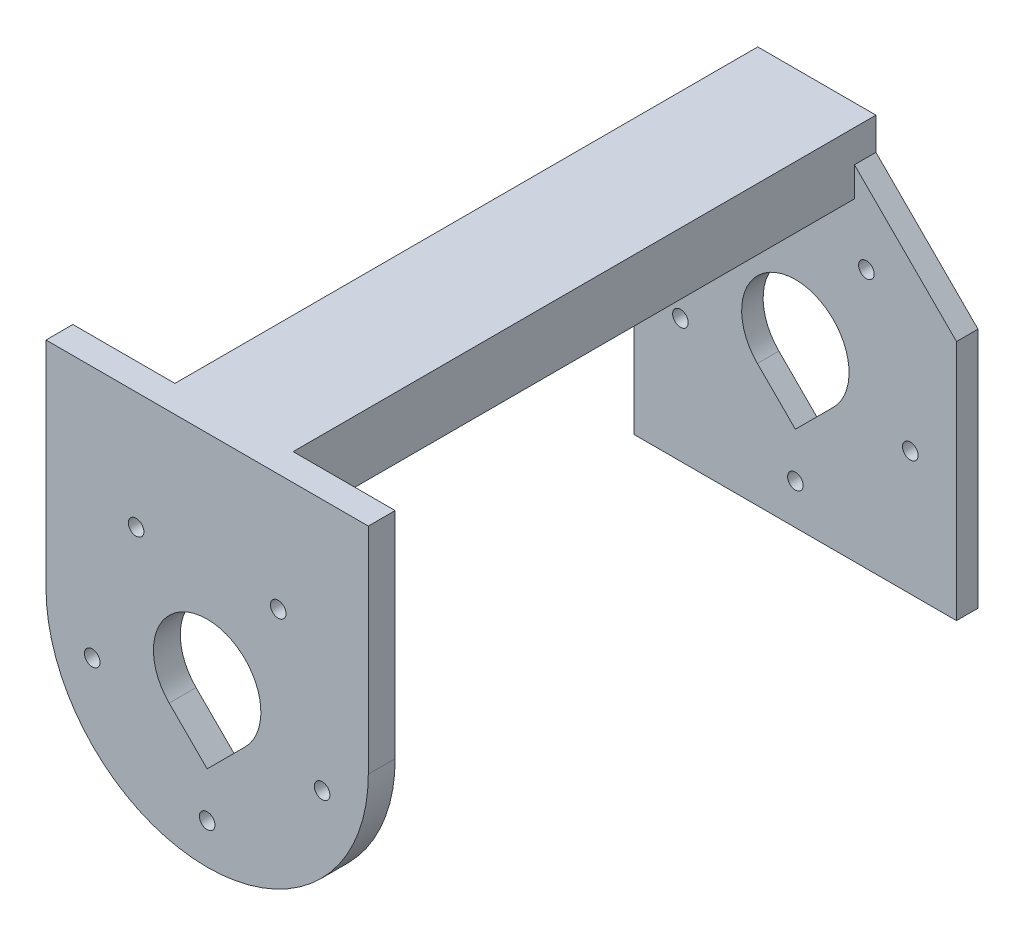
ISO-10303-21;
HEADER;
FILE_DESCRIPTION(('STEP AP214'),'2;1');
FILE_NAME('part.step','',(''),(''),'','','');
FILE_SCHEMA(('AUTOMOTIVE_DESIGN { 1 0 10303 214 1 1 1 1 }'));
ENDSEC;
DATA;
#1=APPLICATION_CONTEXT('core data for automotive mechanical design processes');
#2=APPLICATION_PROTOCOL_DEFINITION('international standard','automotive_design',2000,#1);
#3=PRODUCT_CONTEXT('',#1,'mechanical');
#4=PRODUCT('Part','Part','',(#3));
#5=PRODUCT_RELATED_PRODUCT_CATEGORY('part','',(#4));
#6=PRODUCT_DEFINITION_FORMATION('','',#4);
#7=PRODUCT_DEFINITION_CONTEXT('part definition',#1,'design');
#8=PRODUCT_DEFINITION('design','',#6,#7);
#9=PRODUCT_DEFINITION_SHAPE('','',#8);
#10=(LENGTH_UNIT() NAMED_UNIT(*) SI_UNIT(.MILLI.,.METRE.));
#11=(NAMED_UNIT(*) PLANE_ANGLE_UNIT() SI_UNIT($,.RADIAN.));
#12=(NAMED_UNIT(*) SI_UNIT($,.STERADIAN.) SOLID_ANGLE_UNIT());
#13=UNCERTAINTY_MEASURE_WITH_UNIT(LENGTH_MEASURE(1.E-05),#10,'distance_accuracy_value','');
#14=(GEOMETRIC_REPRESENTATION_CONTEXT(3) GLOBAL_UNCERTAINTY_ASSIGNED_CONTEXT((#13)) GLOBAL_UNIT_ASSIGNED_CONTEXT((#10,
#11,#12)) REPRESENTATION_CONTEXT('',''));
#15=CARTESIAN_POINT('',(0.,0.,0.));
#16=DIRECTION('',(0.,0.,1.));
#17=DIRECTION('',(1.,0.,0.));
#18=AXIS2_PLACEMENT_3D('',#15,#16,#17);
#19=CARTESIAN_POINT('',(289.,328.5,384.5));
#20=DIRECTION('',(0.,1.,0.));
#21=DIRECTION('',(0.,0.,1.));
#22=AXIS2_PLACEMENT_3D('',#19,#20,#21);
#23=PLANE('',#22);
#24=DIRECTION('',(-1.,0.,0.));
#25=VECTOR('',#24,1.);
#26=CARTESIAN_POINT('',(289.,328.5,280.));
#27=LINE('',#26,#25);
#28=CARTESIAN_POINT('',(311.,328.5,280.));
#29=VERTEX_POINT('',#28);
#30=CARTESIAN_POINT('',(289.,328.5,280.));
#31=VERTEX_POINT('',#30);
#32=EDGE_CURVE('E248',#29,#31,#27,.T.);
#33=ORIENTED_EDGE('',*,*,#32,.F.);
#34=DIRECTION('',(0.,0.,-1.));
#35=VECTOR('',#34,1.);
#36=CARTESIAN_POINT('',(311.,328.5,384.5));
#37=LINE('',#36,#35);
#38=CARTESIAN_POINT('',(311.,328.5,384.5));
#39=VERTEX_POINT('',#38);
#40=EDGE_CURVE('E273',#39,#29,#37,.T.);
#41=ORIENTED_EDGE('',*,*,#40,.F.);
#42=DIRECTION('',(1.,0.,0.));
#43=VECTOR('',#42,1.);
#44=CARTESIAN_POINT('',(289.,328.5,384.5));
#45=LINE('',#44,#43);
#46=CARTESIAN_POINT('',(289.,328.5,384.5));
#47=VERTEX_POINT('',#46);
#48=EDGE_CURVE('E256',#47,#39,#45,.T.);
#49=ORIENTED_EDGE('',*,*,#48,.F.);
#50=DIRECTION('',(0.,0.,-1.));
#51=VECTOR('',#50,1.);
#52=CARTESIAN_POINT('',(289.,328.5,384.5));
#53=LINE('',#52,#51);
#54=EDGE_CURVE('E276',#47,#31,#53,.T.);
#55=ORIENTED_EDGE('',*,*,#54,.T.);
#56=EDGE_LOOP('',(#33,#41,#49,#55));
#57=FACE_BOUND('',#56,.T.);
#58=ADVANCED_FACE('F39',(#57),#23,.F.);
#59=CARTESIAN_POINT('',(311.,328.5,384.5));
#60=DIRECTION('',(-1.,0.,0.));
#61=DIRECTION('',(0.,0.,1.));
#62=AXIS2_PLACEMENT_3D('',#59,#60,#61);
#63=PLANE('',#62);
#64=DIRECTION('',(0.,1.,0.));
#65=VECTOR('',#64,1.);
#66=CARTESIAN_POINT('',(311.,328.5,276.));
#67=LINE('',#66,#65);
#68=CARTESIAN_POINT('',(311.,334.,276.));
#69=VERTEX_POINT('',#68);
#70=CARTESIAN_POINT('',(311.,340.,276.));
#71=VERTEX_POINT('',#70);
#72=EDGE_CURVE('E265',#69,#71,#67,.T.);
#73=ORIENTED_EDGE('',*,*,#72,.T.);
#74=DIRECTION('',(0.,0.,-1.));
#75=VECTOR('',#74,1.);
#76=CARTESIAN_POINT('',(311.,340.,384.5));
#77=LINE('',#76,#75);
#78=CARTESIAN_POINT('',(311.,340.,384.5));
#79=VERTEX_POINT('',#78);
#80=EDGE_CURVE('E271',#79,#71,#77,.T.);
#81=ORIENTED_EDGE('',*,*,#80,.F.);
#82=DIRECTION('',(0.,1.,0.));
#83=VECTOR('',#82,1.);
#84=CARTESIAN_POINT('',(311.,328.5,384.5));
#85=LINE('',#84,#83);
#86=EDGE_CURVE('E260',#39,#79,#85,.T.);
#87=ORIENTED_EDGE('',*,*,#86,.F.);
#88=ORIENTED_EDGE('',*,*,#40,.T.);
#89=DIRECTION('',(0.,-1.,0.));
#90=VECTOR('',#89,1.);
#91=CARTESIAN_POINT('',(311.,328.5,280.));
#92=LINE('',#91,#90);
#93=CARTESIAN_POINT('',(311.,334.,280.));
#94=VERTEX_POINT('',#93);
#95=EDGE_CURVE('E11',#94,#29,#92,.T.);
#96=ORIENTED_EDGE('',*,*,#95,.F.);
#97=DIRECTION('',(0.,0.,-1.));
#98=VECTOR('',#97,1.);
#99=CARTESIAN_POINT('',(311.,334.,280.));
#100=LINE('',#99,#98);
#101=EDGE_CURVE('E224',#94,#69,#100,.T.);
#102=ORIENTED_EDGE('',*,*,#101,.T.);
#103=EDGE_LOOP('',(#73,#81,#87,#88,#96,#102));
#104=FACE_BOUND('',#103,.T.);
#105=ADVANCED_FACE('F396',(#104),#63,.F.);
#106=CARTESIAN_POINT('',(300.,300.,389.5));
#107=DIRECTION('',(0.,0.,1.));
#108=DIRECTION('',(1.,0.,0.));
#109=AXIS2_PLACEMENT_3D('',#106,#107,#108);
#110=PLANE('',#109);
#111=CARTESIAN_POINT('',(278.601228383359,293.047117626564,389.5));
#112=DIRECTION('',(0.,0.,1.));
#113=DIRECTION('',(1.,0.,0.));
#114=AXIS2_PLACEMENT_3D('',#111,#112,#113);
#115=CIRCLE('',#114,1.45000000000001);
#116=CARTESIAN_POINT('',(280.051228383359,293.047117626564,389.5));
#117=VERTEX_POINT('',#116);
#118=EDGE_CURVE('E295',#117,#117,#115,.T.);
#119=ORIENTED_EDGE('',*,*,#118,.F.);
#120=EDGE_LOOP('',(#119));
#121=FACE_BOUND('',#120,.T.);
#122=CARTESIAN_POINT('',(321.398771616641,293.047117626564,389.5));
#123=DIRECTION('',(0.,0.,1.));
#124=DIRECTION('',(1.,0.,0.));
#125=AXIS2_PLACEMENT_3D('',#122,#123,#124);
#126=CIRCLE('',#125,1.45000000000001);
#127=CARTESIAN_POINT('',(322.848771616641,293.047117626564,389.5));
#128=VERTEX_POINT('',#127);
#129=EDGE_CURVE('E282',#128,#128,#126,.T.);
#130=ORIENTED_EDGE('',*,*,#129,.F.);
#131=EDGE_LOOP('',(#130));
#132=FACE_BOUND('',#131,.T.);
#133=DIRECTION('',(0.707106781186545,-0.70710678118655,0.));
#134=VECTOR('',#133,1.);
#135=CARTESIAN_POINT('',(292.928932188135,292.928932188135,389.5));
#136=LINE('',#135,#134);
#137=CARTESIAN_POINT('',(292.928932188135,292.928932188135,389.5));
#138=VERTEX_POINT('',#137);
#139=CARTESIAN_POINT('',(300.,285.857864376269,389.5));
#140=VERTEX_POINT('',#139);
#141=EDGE_CURVE('E311',#138,#140,#136,.T.);
#142=ORIENTED_EDGE('',*,*,#141,.F.);
#143=CARTESIAN_POINT('',(300.,300.,389.5));
#144=DIRECTION('',(0.,0.,1.));
#145=DIRECTION('',(1.,0.,0.));
#146=AXIS2_PLACEMENT_3D('',#143,#144,#145);
#147=CIRCLE('',#146,9.99999999999998);
#148=CARTESIAN_POINT('',(307.071067811865,292.928932188135,389.5));
#149=VERTEX_POINT('',#148);
#150=EDGE_CURVE('E309',#149,#138,#147,.T.);
#151=ORIENTED_EDGE('',*,*,#150,.F.);
#152=DIRECTION('',(0.707106781186547,0.707106781186547,0.));
#153=VECTOR('',#152,1.);
#154=CARTESIAN_POINT('',(300.,285.857864376269,389.5));
#155=LINE('',#154,#153);
#156=EDGE_CURVE('E315',#140,#149,#155,.T.);
#157=ORIENTED_EDGE('',*,*,#156,.F.);
#158=EDGE_LOOP('',(#142,#151,#157));
#159=FACE_BOUND('',#158,.T.);
#160=CARTESIAN_POINT('',(300.,300.,389.5));
#161=DIRECTION('',(0.,0.,1.));
#162=DIRECTION('',(1.,0.,0.));
#163=AXIS2_PLACEMENT_3D('',#160,#161,#162);
#164=CIRCLE('',#163,30.);
#165=CARTESIAN_POINT('',(270.,300.,389.5));
#166=VERTEX_POINT('',#165);
#167=CARTESIAN_POINT('',(330.,300.,389.5));
#168=VERTEX_POINT('',#167);
#169=EDGE_CURVE('E47',#166,#168,#164,.T.);
#170=ORIENTED_EDGE('',*,*,#169,.T.);
#171=DIRECTION('',(0.,1.,0.));
#172=VECTOR('',#171,1.);
#173=CARTESIAN_POINT('',(330.,300.,389.5));
#174=LINE('',#173,#172);
#175=CARTESIAN_POINT('',(330.,340.,389.5));
#176=VERTEX_POINT('',#175);
#177=EDGE_CURVE('E336',#168,#176,#174,.T.);
#178=ORIENTED_EDGE('',*,*,#177,.T.);
#179=DIRECTION('',(-1.,0.,0.));
#180=VECTOR('',#179,1.);
#181=CARTESIAN_POINT('',(330.,340.,389.5));
#182=LINE('',#181,#180);
#183=CARTESIAN_POINT('',(270.,340.,389.5));
#184=VERTEX_POINT('',#183);
#185=EDGE_CURVE('E339',#176,#184,#182,.T.);
#186=ORIENTED_EDGE('',*,*,#185,.T.);
#187=DIRECTION('',(0.,-1.,0.));
#188=VECTOR('',#187,1.);
#189=CARTESIAN_POINT('',(270.,340.,389.5));
#190=LINE('',#189,#188);
#191=EDGE_CURVE('E333',#184,#166,#190,.T.);
#192=ORIENTED_EDGE('',*,*,#191,.T.);
#193=EDGE_LOOP('',(#170,#178,#186,#192));
#194=FACE_BOUND('',#193,.T.);
#195=CARTESIAN_POINT('',(313.225168176581,318.202882373436,389.5));
#196=DIRECTION('',(0.,0.,1.));
#197=DIRECTION('',(1.,0.,0.));
#198=AXIS2_PLACEMENT_3D('',#195,#196,#197);
#199=CIRCLE('',#198,1.45000000000001);
#200=CARTESIAN_POINT('',(314.675168176581,318.202882373436,389.5));
#201=VERTEX_POINT('',#200);
#202=EDGE_CURVE('E278',#201,#201,#199,.T.);
#203=ORIENTED_EDGE('',*,*,#202,.F.);
#204=EDGE_LOOP('',(#203));
#205=FACE_BOUND('',#204,.T.);
#206=CARTESIAN_POINT('',(300.,277.5,389.5));
#207=DIRECTION('',(0.,0.,1.));
#208=DIRECTION('',(1.,0.,0.));
#209=AXIS2_PLACEMENT_3D('',#206,#207,#208);
#210=CIRCLE('',#209,1.45000000000001);
#211=CARTESIAN_POINT('',(301.45,277.5,389.5));
#212=VERTEX_POINT('',#211);
#213=EDGE_CURVE('E301',#212,#212,#210,.T.);
#214=ORIENTED_EDGE('',*,*,#213,.F.);
#215=EDGE_LOOP('',(#214));
#216=FACE_BOUND('',#215,.T.);
#217=CARTESIAN_POINT('',(286.774831823419,318.202882373436,389.5));
#218=DIRECTION('',(0.,0.,1.));
#219=DIRECTION('',(1.,0.,0.));
#220=AXIS2_PLACEMENT_3D('',#217,#218,#219);
#221=CIRCLE('',#220,1.45000000000001);
#222=CARTESIAN_POINT('',(288.224831823419,318.202882373436,389.5));
#223=VERTEX_POINT('',#222);
#224=EDGE_CURVE('E289',#223,#223,#221,.T.);
#225=ORIENTED_EDGE('',*,*,#224,.F.);
#226=EDGE_LOOP('',(#225));
#227=FACE_BOUND('',#226,.T.);
#228=ADVANCED_FACE('F382',(#121,#132,#159,#194,#205,#216,#227),#110,.T.);
#229=CARTESIAN_POINT('',(300.,300.,384.5));
#230=DIRECTION('',(0.,0.,1.));
#231=DIRECTION('',(1.,0.,0.));
#232=AXIS2_PLACEMENT_3D('',#229,#230,#231);
#233=PLANE('',#232);
#234=DIRECTION('',(-1.,0.,0.));
#235=VECTOR('',#234,1.);
#236=CARTESIAN_POINT('',(330.,340.,384.5));
#237=LINE('',#236,#235);
#238=CARTESIAN_POINT('',(289.,340.,384.5));
#239=VERTEX_POINT('',#238);
#240=CARTESIAN_POINT('',(270.,340.,384.5));
#241=VERTEX_POINT('',#240);
#242=EDGE_CURVE('E346',#239,#241,#237,.T.);
#243=ORIENTED_EDGE('',*,*,#242,.F.);
#244=DIRECTION('',(0.,-1.,0.));
#245=VECTOR('',#244,1.);
#246=CARTESIAN_POINT('',(289.,340.,384.5));
#247=LINE('',#246,#245);
#248=EDGE_CURVE('E253',#239,#47,#247,.T.);
#249=ORIENTED_EDGE('',*,*,#248,.T.);
#250=ORIENTED_EDGE('',*,*,#48,.T.);
#251=ORIENTED_EDGE('',*,*,#86,.T.);
#252=CARTESIAN_POINT('',(330.,340.,384.5));
#253=VERTEX_POINT('',#252);
#254=EDGE_CURVE('E337',#253,#79,#237,.T.);
#255=ORIENTED_EDGE('',*,*,#254,.F.);
#256=DIRECTION('',(0.,1.,0.));
#257=VECTOR('',#256,1.);
#258=CARTESIAN_POINT('',(330.,300.,384.5));
#259=LINE('',#258,#257);
#260=CARTESIAN_POINT('',(330.,300.,384.5));
#261=VERTEX_POINT('',#260);
#262=EDGE_CURVE('E344',#261,#253,#259,.T.);
#263=ORIENTED_EDGE('',*,*,#262,.F.);
#264=CARTESIAN_POINT('',(300.,300.,384.5));
#265=DIRECTION('',(0.,0.,1.));
#266=DIRECTION('',(1.,0.,0.));
#267=AXIS2_PLACEMENT_3D('',#264,#265,#266);
#268=CIRCLE('',#267,30.);
#269=CARTESIAN_POINT('',(270.,300.,384.5));
#270=VERTEX_POINT('',#269);
#271=EDGE_CURVE('E360',#270,#261,#268,.T.);
#272=ORIENTED_EDGE('',*,*,#271,.F.);
#273=DIRECTION('',(0.,-1.,0.));
#274=VECTOR('',#273,1.);
#275=CARTESIAN_POINT('',(270.,340.,384.5));
#276=LINE('',#275,#274);
#277=EDGE_CURVE('E332',#241,#270,#276,.T.);
#278=ORIENTED_EDGE('',*,*,#277,.F.);
#279=EDGE_LOOP('',(#243,#249,#250,#251,#255,#263,#272,#278));
#280=FACE_BOUND('',#279,.T.);
#281=CARTESIAN_POINT('',(300.,300.,384.5));
#282=DIRECTION('',(0.,0.,1.));
#283=DIRECTION('',(1.,0.,0.));
#284=AXIS2_PLACEMENT_3D('',#281,#282,#283);
#285=CIRCLE('',#284,9.99999999999998);
#286=CARTESIAN_POINT('',(307.071067811865,292.928932188135,384.5));
#287=VERTEX_POINT('',#286);
#288=CARTESIAN_POINT('',(292.928932188135,292.928932188135,384.5));
#289=VERTEX_POINT('',#288);
#290=EDGE_CURVE('E288',#287,#289,#285,.T.);
#291=ORIENTED_EDGE('',*,*,#290,.T.);
#292=DIRECTION('',(0.707106781186545,-0.70710678118655,0.));
#293=VECTOR('',#292,1.);
#294=CARTESIAN_POINT('',(292.928932188135,292.928932188135,384.5));
#295=LINE('',#294,#293);
#296=CARTESIAN_POINT('',(300.,285.857864376269,384.5));
#297=VERTEX_POINT('',#296);
#298=EDGE_CURVE('E320',#289,#297,#295,.T.);
#299=ORIENTED_EDGE('',*,*,#298,.T.);
#300=DIRECTION('',(0.707106781186547,0.707106781186547,0.));
#301=VECTOR('',#300,1.);
#302=CARTESIAN_POINT('',(300.,285.857864376269,384.5));
#303=LINE('',#302,#301);
#304=EDGE_CURVE('E312',#297,#287,#303,.T.);
#305=ORIENTED_EDGE('',*,*,#304,.T.);
#306=EDGE_LOOP('',(#291,#299,#305));
#307=FACE_BOUND('',#306,.T.);
#308=CARTESIAN_POINT('',(313.225168176581,318.202882373436,384.5));
#309=DIRECTION('',(0.,0.,1.));
#310=DIRECTION('',(1.,0.,0.));
#311=AXIS2_PLACEMENT_3D('',#308,#309,#310);
#312=CIRCLE('',#311,1.45000000000001);
#313=CARTESIAN_POINT('',(314.675168176581,318.202882373436,384.5));
#314=VERTEX_POINT('',#313);
#315=EDGE_CURVE('E279',#314,#314,#312,.T.);
#316=ORIENTED_EDGE('',*,*,#315,.T.);
#317=EDGE_LOOP('',(#316));
#318=FACE_BOUND('',#317,.T.);
#319=CARTESIAN_POINT('',(321.398771616641,293.047117626564,384.5));
#320=DIRECTION('',(0.,0.,1.));
#321=DIRECTION('',(1.,0.,0.));
#322=AXIS2_PLACEMENT_3D('',#319,#320,#321);
#323=CIRCLE('',#322,1.45000000000001);
#324=CARTESIAN_POINT('',(322.848771616641,293.047117626564,384.5));
#325=VERTEX_POINT('',#324);
#326=EDGE_CURVE('E304',#325,#325,#323,.T.);
#327=ORIENTED_EDGE('',*,*,#326,.T.);
#328=EDGE_LOOP('',(#327));
#329=FACE_BOUND('',#328,.T.);
#330=CARTESIAN_POINT('',(300.,277.5,384.5));
#331=DIRECTION('',(0.,0.,1.));
#332=DIRECTION('',(1.,0.,0.));
#333=AXIS2_PLACEMENT_3D('',#330,#331,#332);
#334=CIRCLE('',#333,1.45000000000001);
#335=CARTESIAN_POINT('',(301.45,277.5,384.5));
#336=VERTEX_POINT('',#335);
#337=EDGE_CURVE('E298',#336,#336,#334,.T.);
#338=ORIENTED_EDGE('',*,*,#337,.T.);
#339=EDGE_LOOP('',(#338));
#340=FACE_BOUND('',#339,.T.);
#341=CARTESIAN_POINT('',(278.601228383359,293.047117626564,384.5));
#342=DIRECTION('',(0.,0.,1.));
#343=DIRECTION('',(1.,0.,0.));
#344=AXIS2_PLACEMENT_3D('',#341,#342,#343);
#345=CIRCLE('',#344,1.45000000000001);
#346=CARTESIAN_POINT('',(280.051228383359,293.047117626564,384.5));
#347=VERTEX_POINT('',#346);
#348=EDGE_CURVE('E292',#347,#347,#345,.T.);
#349=ORIENTED_EDGE('',*,*,#348,.T.);
#350=EDGE_LOOP('',(#349));
#351=FACE_BOUND('',#350,.T.);
#352=CARTESIAN_POINT('',(286.774831823419,318.202882373436,384.5));
#353=DIRECTION('',(0.,0.,1.));
#354=DIRECTION('',(1.,0.,0.));
#355=AXIS2_PLACEMENT_3D('',#352,#353,#354);
#356=CIRCLE('',#355,1.45000000000001);
#357=CARTESIAN_POINT('',(288.224831823419,318.202882373436,384.5));
#358=VERTEX_POINT('',#357);
#359=EDGE_CURVE('E285',#358,#358,#356,.T.);
#360=ORIENTED_EDGE('',*,*,#359,.T.);
#361=EDGE_LOOP('',(#360));
#362=FACE_BOUND('',#361,.T.);
#363=ADVANCED_FACE('F373',(#280,#307,#318,#329,#340,#351,#362),#233,.F.);
#364=CARTESIAN_POINT('',(300.,300.,389.5));
#365=DIRECTION('',(0.,0.,-1.));
#366=DIRECTION('',(-1.,0.,0.));
#367=AXIS2_PLACEMENT_3D('',#364,#365,#366);
#368=CYLINDRICAL_SURFACE('',#367,30.);
#369=DIRECTION('',(0.,0.,-1.));
#370=VECTOR('',#369,1.);
#371=CARTESIAN_POINT('',(270.,300.,389.5));
#372=LINE('',#371,#370);
#373=EDGE_CURVE('E357',#166,#270,#372,.T.);
#374=ORIENTED_EDGE('',*,*,#373,.T.);
#375=ORIENTED_EDGE('',*,*,#271,.T.);
#376=DIRECTION('',(0.,0.,-1.));
#377=VECTOR('',#376,1.);
#378=CARTESIAN_POINT('',(330.,300.,389.5));
#379=LINE('',#378,#377);
#380=EDGE_CURVE('E354',#168,#261,#379,.T.);
#381=ORIENTED_EDGE('',*,*,#380,.F.);
#382=ORIENTED_EDGE('',*,*,#169,.F.);
#383=EDGE_LOOP('',(#374,#375,#381,#382));
#384=FACE_BOUND('',#383,.T.);
#385=ADVANCED_FACE('F41',(#384),#368,.T.);
#386=CARTESIAN_POINT('',(270.,340.,389.5));
#387=DIRECTION('',(1.,0.,0.));
#388=DIRECTION('',(0.,0.,-1.));
#389=AXIS2_PLACEMENT_3D('',#386,#387,#388);
#390=PLANE('',#389);
#391=ORIENTED_EDGE('',*,*,#277,.T.);
#392=ORIENTED_EDGE('',*,*,#373,.F.);
#393=ORIENTED_EDGE('',*,*,#191,.F.);
#394=DIRECTION('',(0.,0.,-1.));
#395=VECTOR('',#394,1.);
#396=CARTESIAN_POINT('',(270.,340.,389.5));
#397=LINE('',#396,#395);
#398=EDGE_CURVE('E341',#184,#241,#397,.T.);
#399=ORIENTED_EDGE('',*,*,#398,.T.);
#400=EDGE_LOOP('',(#391,#392,#393,#399));
#401=FACE_BOUND('',#400,.T.);
#402=ADVANCED_FACE('F385',(#401),#390,.F.);
#403=CARTESIAN_POINT('',(330.,300.,389.5));
#404=DIRECTION('',(-1.,0.,0.));
#405=DIRECTION('',(0.,0.,1.));
#406=AXIS2_PLACEMENT_3D('',#403,#404,#405);
#407=PLANE('',#406);
#408=ORIENTED_EDGE('',*,*,#262,.T.);
#409=DIRECTION('',(0.,0.,-1.));
#410=VECTOR('',#409,1.);
#411=CARTESIAN_POINT('',(330.,340.,389.5));
#412=LINE('',#411,#410);
#413=EDGE_CURVE('E351',#176,#253,#412,.T.);
#414=ORIENTED_EDGE('',*,*,#413,.F.);
#415=ORIENTED_EDGE('',*,*,#177,.F.);
#416=ORIENTED_EDGE('',*,*,#380,.T.);
#417=EDGE_LOOP('',(#408,#414,#415,#416));
#418=FACE_BOUND('',#417,.T.);
#419=ADVANCED_FACE('F369',(#418),#407,.F.);
#420=CARTESIAN_POINT('',(330.,340.,389.5));
#421=DIRECTION('',(0.,-1.,0.));
#422=DIRECTION('',(0.,0.,-1.));
#423=AXIS2_PLACEMENT_3D('',#420,#421,#422);
#424=PLANE('',#423);
#425=DIRECTION('',(-1.,0.,0.));
#426=VECTOR('',#425,1.);
#427=CARTESIAN_POINT('',(311.,340.,276.));
#428=LINE('',#427,#426);
#429=CARTESIAN_POINT('',(289.,340.,276.));
#430=VERTEX_POINT('',#429);
#431=EDGE_CURVE('E257',#71,#430,#428,.T.);
#432=ORIENTED_EDGE('',*,*,#431,.T.);
#433=DIRECTION('',(0.,0.,-1.));
#434=VECTOR('',#433,1.);
#435=CARTESIAN_POINT('',(289.,340.,384.5));
#436=LINE('',#435,#434);
#437=EDGE_CURVE('E263',#239,#430,#436,.T.);
#438=ORIENTED_EDGE('',*,*,#437,.F.);
#439=ORIENTED_EDGE('',*,*,#242,.T.);
#440=ORIENTED_EDGE('',*,*,#398,.F.);
#441=ORIENTED_EDGE('',*,*,#185,.F.);
#442=ORIENTED_EDGE('',*,*,#413,.T.);
#443=ORIENTED_EDGE('',*,*,#254,.T.);
#444=ORIENTED_EDGE('',*,*,#80,.T.);
#445=EDGE_LOOP('',(#432,#438,#439,#440,#441,#442,#443,#444));
#446=FACE_BOUND('',#445,.T.);
#447=ADVANCED_FACE('F377',(#446),#424,.F.);
#448=CARTESIAN_POINT('',(300.,300.,389.5));
#449=DIRECTION('',(0.,0.,-1.));
#450=DIRECTION('',(-1.,0.,0.));
#451=AXIS2_PLACEMENT_3D('',#448,#449,#450);
#452=CYLINDRICAL_SURFACE('',#451,9.99999999999998);
#453=ORIENTED_EDGE('',*,*,#290,.F.);
#454=DIRECTION('',(0.,0.,-1.));
#455=VECTOR('',#454,1.);
#456=CARTESIAN_POINT('',(307.071067811865,292.928932188135,389.5));
#457=LINE('',#456,#455);
#458=EDGE_CURVE('E317',#149,#287,#457,.T.);
#459=ORIENTED_EDGE('',*,*,#458,.F.);
#460=ORIENTED_EDGE('',*,*,#150,.T.);
#461=DIRECTION('',(0.,0.,-1.));
#462=VECTOR('',#461,1.);
#463=CARTESIAN_POINT('',(292.928932188135,292.928932188135,389.5));
#464=LINE('',#463,#462);
#465=EDGE_CURVE('E329',#138,#289,#464,.T.);
#466=ORIENTED_EDGE('',*,*,#465,.T.);
#467=EDGE_LOOP('',(#453,#459,#460,#466));
#468=FACE_BOUND('',#467,.T.);
#469=ADVANCED_FACE('F469',(#468),#452,.F.);
#470=CARTESIAN_POINT('',(292.928932188135,292.928932188135,389.5));
#471=DIRECTION('',(0.70710678118655,0.707106781186545,0.));
#472=DIRECTION('',(-0.707106781186545,0.70710678118655,0.));
#473=AXIS2_PLACEMENT_3D('',#470,#471,#472);
#474=PLANE('',#473);
#475=ORIENTED_EDGE('',*,*,#298,.F.);
#476=ORIENTED_EDGE('',*,*,#465,.F.);
#477=ORIENTED_EDGE('',*,*,#141,.T.);
#478=DIRECTION('',(0.,0.,-1.));
#479=VECTOR('',#478,1.);
#480=CARTESIAN_POINT('',(300.,285.857864376269,389.5));
#481=LINE('',#480,#479);
#482=EDGE_CURVE('E327',#140,#297,#481,.T.);
#483=ORIENTED_EDGE('',*,*,#482,.T.);
#484=EDGE_LOOP('',(#475,#476,#477,#483));
#485=FACE_BOUND('',#484,.T.);
#486=ADVANCED_FACE('F465',(#485),#474,.T.);
#487=CARTESIAN_POINT('',(300.,285.857864376269,389.5));
#488=DIRECTION('',(-0.707106781186548,0.707106781186548,0.));
#489=DIRECTION('',(-0.707106781186548,-0.707106781186548,0.));
#490=AXIS2_PLACEMENT_3D('',#487,#488,#489);
#491=PLANE('',#490);
#492=ORIENTED_EDGE('',*,*,#304,.F.);
#493=ORIENTED_EDGE('',*,*,#482,.F.);
#494=ORIENTED_EDGE('',*,*,#156,.T.);
#495=ORIENTED_EDGE('',*,*,#458,.T.);
#496=EDGE_LOOP('',(#492,#493,#494,#495));
#497=FACE_BOUND('',#496,.T.);
#498=ADVANCED_FACE('F448',(#497),#491,.T.);
#499=CARTESIAN_POINT('',(313.225168176581,318.202882373436,389.5));
#500=DIRECTION('',(0.,0.,-1.));
#501=DIRECTION('',(-1.,0.,0.));
#502=AXIS2_PLACEMENT_3D('',#499,#500,#501);
#503=CYLINDRICAL_SURFACE('',#502,1.45000000000001);
#504=ORIENTED_EDGE('',*,*,#202,.T.);
#505=EDGE_LOOP('',(#504));
#506=FACE_BOUND('',#505,.T.);
#507=ORIENTED_EDGE('',*,*,#315,.F.);
#508=EDGE_LOOP('',(#507));
#509=FACE_BOUND('',#508,.T.);
#510=ADVANCED_FACE('F444',(#506,#509),#503,.F.);
#511=CARTESIAN_POINT('',(321.398771616641,293.047117626564,389.5));
#512=DIRECTION('',(0.,0.,-1.));
#513=DIRECTION('',(-1.,0.,0.));
#514=AXIS2_PLACEMENT_3D('',#511,#512,#513);
#515=CYLINDRICAL_SURFACE('',#514,1.45000000000001);
#516=ORIENTED_EDGE('',*,*,#129,.T.);
#517=EDGE_LOOP('',(#516));
#518=FACE_BOUND('',#517,.T.);
#519=ORIENTED_EDGE('',*,*,#326,.F.);
#520=EDGE_LOOP('',(#519));
#521=FACE_BOUND('',#520,.T.);
#522=ADVANCED_FACE('F447',(#518,#521),#515,.F.);
#523=CARTESIAN_POINT('',(300.,277.5,389.5));
#524=DIRECTION('',(0.,0.,-1.));
#525=DIRECTION('',(-1.,0.,0.));
#526=AXIS2_PLACEMENT_3D('',#523,#524,#525);
#527=CYLINDRICAL_SURFACE('',#526,1.45000000000001);
#528=ORIENTED_EDGE('',*,*,#213,.T.);
#529=EDGE_LOOP('',(#528));
#530=FACE_BOUND('',#529,.T.);
#531=ORIENTED_EDGE('',*,*,#337,.F.);
#532=EDGE_LOOP('',(#531));
#533=FACE_BOUND('',#532,.T.);
#534=ADVANCED_FACE('F455',(#530,#533),#527,.F.);
#535=CARTESIAN_POINT('',(278.601228383359,293.047117626564,389.5));
#536=DIRECTION('',(0.,0.,-1.));
#537=DIRECTION('',(-1.,0.,0.));
#538=AXIS2_PLACEMENT_3D('',#535,#536,#537);
#539=CYLINDRICAL_SURFACE('',#538,1.45000000000001);
#540=ORIENTED_EDGE('',*,*,#118,.T.);
#541=EDGE_LOOP('',(#540));
#542=FACE_BOUND('',#541,.T.);
#543=ORIENTED_EDGE('',*,*,#348,.F.);
#544=EDGE_LOOP('',(#543));
#545=FACE_BOUND('',#544,.T.);
#546=ADVANCED_FACE('F451',(#542,#545),#539,.F.);
#547=CARTESIAN_POINT('',(286.774831823419,318.202882373436,389.5));
#548=DIRECTION('',(0.,0.,-1.));
#549=DIRECTION('',(-1.,0.,0.));
#550=AXIS2_PLACEMENT_3D('',#547,#548,#549);
#551=CYLINDRICAL_SURFACE('',#550,1.45000000000001);
#552=ORIENTED_EDGE('',*,*,#224,.T.);
#553=EDGE_LOOP('',(#552));
#554=FACE_BOUND('',#553,.T.);
#555=ORIENTED_EDGE('',*,*,#359,.F.);
#556=EDGE_LOOP('',(#555));
#557=FACE_BOUND('',#556,.T.);
#558=ADVANCED_FACE('F443',(#554,#557),#551,.F.);
#559=CARTESIAN_POINT('',(289.,340.,384.5));
#560=DIRECTION('',(1.,0.,0.));
#561=DIRECTION('',(0.,0.,-1.));
#562=AXIS2_PLACEMENT_3D('',#559,#560,#561);
#563=PLANE('',#562);
#564=DIRECTION('',(0.,0.,-1.));
#565=VECTOR('',#564,1.);
#566=CARTESIAN_POINT('',(289.,334.,280.));
#567=LINE('',#566,#565);
#568=CARTESIAN_POINT('',(289.,334.,280.));
#569=VERTEX_POINT('',#568);
#570=CARTESIAN_POINT('',(289.,334.,276.));
#571=VERTEX_POINT('',#570);
#572=EDGE_CURVE('E54',#569,#571,#567,.T.);
#573=ORIENTED_EDGE('',*,*,#572,.F.);
#574=DIRECTION('',(0.,1.,0.));
#575=VECTOR('',#574,1.);
#576=CARTESIAN_POINT('',(289.,340.,280.));
#577=LINE('',#576,#575);
#578=EDGE_CURVE('E58',#31,#569,#577,.T.);
#579=ORIENTED_EDGE('',*,*,#578,.F.);
#580=ORIENTED_EDGE('',*,*,#54,.F.);
#581=ORIENTED_EDGE('',*,*,#248,.F.);
#582=ORIENTED_EDGE('',*,*,#437,.T.);
#583=DIRECTION('',(0.,-1.,0.));
#584=VECTOR('',#583,1.);
#585=CARTESIAN_POINT('',(289.,340.,276.));
#586=LINE('',#585,#584);
#587=EDGE_CURVE('E252',#430,#571,#586,.T.);
#588=ORIENTED_EDGE('',*,*,#587,.T.);
#589=EDGE_LOOP('',(#573,#579,#580,#581,#582,#588));
#590=FACE_BOUND('',#589,.T.);
#591=ADVANCED_FACE('F389',(#590),#563,.F.);
#592=CARTESIAN_POINT('',(0.,0.,276.));
#593=DIRECTION('',(0.,0.,1.));
#594=DIRECTION('',(1.,0.,0.));
#595=AXIS2_PLACEMENT_3D('',#592,#593,#594);
#596=PLANE('',#595);
#597=ORIENTED_EDGE('',*,*,#587,.F.);
#598=ORIENTED_EDGE('',*,*,#431,.F.);
#599=ORIENTED_EDGE('',*,*,#72,.F.);
#600=DIRECTION('',(-0.707106781186547,0.707106781186547,0.));
#601=VECTOR('',#600,1.);
#602=CARTESIAN_POINT('',(311.,334.,276.));
#603=LINE('',#602,#601);
#604=CARTESIAN_POINT('',(330.,315.,276.));
#605=VERTEX_POINT('',#604);
#606=EDGE_CURVE('E215',#605,#69,#603,.T.);
#607=ORIENTED_EDGE('',*,*,#606,.F.);
#608=DIRECTION('',(0.,1.,0.));
#609=VECTOR('',#608,1.);
#610=CARTESIAN_POINT('',(330.,315.,276.));
#611=LINE('',#610,#609);
#612=CARTESIAN_POINT('',(330.,270.,276.));
#613=VERTEX_POINT('',#612);
#614=EDGE_CURVE('E230',#613,#605,#611,.T.);
#615=ORIENTED_EDGE('',*,*,#614,.F.);
#616=DIRECTION('',(1.,0.,0.));
#617=VECTOR('',#616,1.);
#618=CARTESIAN_POINT('',(330.,270.,276.));
#619=LINE('',#618,#617);
#620=CARTESIAN_POINT('',(270.,270.,276.));
#621=VERTEX_POINT('',#620);
#622=EDGE_CURVE('E228',#621,#613,#619,.T.);
#623=ORIENTED_EDGE('',*,*,#622,.F.);
#624=DIRECTION('',(0.,-1.,0.));
#625=VECTOR('',#624,1.);
#626=CARTESIAN_POINT('',(270.,270.,276.));
#627=LINE('',#626,#625);
#628=CARTESIAN_POINT('',(270.,315.,276.));
#629=VERTEX_POINT('',#628);
#630=EDGE_CURVE('E226',#629,#621,#627,.T.);
#631=ORIENTED_EDGE('',*,*,#630,.F.);
#632=DIRECTION('',(-0.707106781186546,-0.707106781186549,0.));
#633=VECTOR('',#632,1.);
#634=CARTESIAN_POINT('',(270.,315.,276.));
#635=LINE('',#634,#633);
#636=EDGE_CURVE('E194',#571,#629,#635,.T.);
#637=ORIENTED_EDGE('',*,*,#636,.F.);
#638=EDGE_LOOP('',(#597,#598,#599,#607,#615,#623,#631,#637));
#639=FACE_BOUND('',#638,.T.);
#640=CARTESIAN_POINT('',(313.225168176581,318.202882373436,276.));
#641=DIRECTION('',(0.,0.,1.));
#642=DIRECTION('',(1.,0.,0.));
#643=AXIS2_PLACEMENT_3D('',#640,#641,#642);
#644=CIRCLE('',#643,1.45000000000001);
#645=CARTESIAN_POINT('',(314.675168176581,318.202882373436,276.));
#646=VERTEX_POINT('',#645);
#647=EDGE_CURVE('E718',#646,#646,#644,.T.);
#648=ORIENTED_EDGE('',*,*,#647,.T.);
#649=EDGE_LOOP('',(#648));
#650=FACE_BOUND('',#649,.T.);
#651=CARTESIAN_POINT('',(300.,277.5,276.));
#652=DIRECTION('',(0.,0.,1.));
#653=DIRECTION('',(1.,0.,0.));
#654=AXIS2_PLACEMENT_3D('',#651,#652,#653);
#655=CIRCLE('',#654,1.45000000000001);
#656=CARTESIAN_POINT('',(301.45,277.5,276.));
#657=VERTEX_POINT('',#656);
#658=EDGE_CURVE('E726',#657,#657,#655,.T.);
#659=ORIENTED_EDGE('',*,*,#658,.T.);
#660=EDGE_LOOP('',(#659));
#661=FACE_BOUND('',#660,.T.);
#662=CARTESIAN_POINT('',(286.774831823419,318.202882373436,276.));
#663=DIRECTION('',(0.,0.,1.));
#664=DIRECTION('',(1.,0.,0.));
#665=AXIS2_PLACEMENT_3D('',#662,#663,#664);
#666=CIRCLE('',#665,1.45000000000001);
#667=CARTESIAN_POINT('',(288.224831823419,318.202882373436,276.));
#668=VERTEX_POINT('',#667);
#669=EDGE_CURVE('E738',#668,#668,#666,.T.);
#670=ORIENTED_EDGE('',*,*,#669,.T.);
#671=EDGE_LOOP('',(#670));
#672=FACE_BOUND('',#671,.T.);
#673=DIRECTION('',(0.707106781186547,0.707106781186547,0.));
#674=VECTOR('',#673,1.);
#675=CARTESIAN_POINT('',(300.,285.857864376269,276.));
#676=LINE('',#675,#674);
#677=CARTESIAN_POINT('',(300.,285.857864376269,276.));
#678=VERTEX_POINT('',#677);
#679=CARTESIAN_POINT('',(307.071067811865,292.928932188134,276.));
#680=VERTEX_POINT('',#679);
#681=EDGE_CURVE('E187',#678,#680,#676,.T.);
#682=ORIENTED_EDGE('',*,*,#681,.T.);
#683=CARTESIAN_POINT('',(300.,300.,276.));
#684=DIRECTION('',(0.,0.,1.));
#685=DIRECTION('',(1.,0.,0.));
#686=AXIS2_PLACEMENT_3D('',#683,#684,#685);
#687=CIRCLE('',#686,9.99999999999998);
#688=CARTESIAN_POINT('',(292.928932188135,292.928932188135,276.));
#689=VERTEX_POINT('',#688);
#690=EDGE_CURVE('E204',#680,#689,#687,.T.);
#691=ORIENTED_EDGE('',*,*,#690,.T.);
#692=DIRECTION('',(0.707106781186545,-0.70710678118655,0.));
#693=VECTOR('',#692,1.);
#694=CARTESIAN_POINT('',(292.928932188135,292.928932188135,276.));
#695=LINE('',#694,#693);
#696=EDGE_CURVE('E193',#689,#678,#695,.T.);
#697=ORIENTED_EDGE('',*,*,#696,.T.);
#698=EDGE_LOOP('',(#682,#691,#697));
#699=FACE_BOUND('',#698,.T.);
#700=CARTESIAN_POINT('',(278.601228383359,293.047117626564,276.));
#701=DIRECTION('',(0.,0.,1.));
#702=DIRECTION('',(1.,0.,0.));
#703=AXIS2_PLACEMENT_3D('',#700,#701,#702);
#704=CIRCLE('',#703,1.45000000000001);
#705=CARTESIAN_POINT('',(280.051228383359,293.047117626564,276.));
#706=VERTEX_POINT('',#705);
#707=EDGE_CURVE('E732',#706,#706,#704,.T.);
#708=ORIENTED_EDGE('',*,*,#707,.T.);
#709=EDGE_LOOP('',(#708));
#710=FACE_BOUND('',#709,.T.);
#711=CARTESIAN_POINT('',(321.398771616641,293.047117626564,276.));
#712=DIRECTION('',(0.,0.,1.));
#713=DIRECTION('',(1.,0.,0.));
#714=AXIS2_PLACEMENT_3D('',#711,#712,#713);
#715=CIRCLE('',#714,1.45000000000001);
#716=CARTESIAN_POINT('',(322.848771616641,293.047117626564,276.));
#717=VERTEX_POINT('',#716);
#718=EDGE_CURVE('E720',#717,#717,#715,.T.);
#719=ORIENTED_EDGE('',*,*,#718,.T.);
#720=EDGE_LOOP('',(#719));
#721=FACE_BOUND('',#720,.T.);
#722=ADVANCED_FACE('F400',(#639,#650,#661,#672,#699,#710,#721),#596,.F.);
#723=CARTESIAN_POINT('',(0.,0.,280.));
#724=DIRECTION('',(0.,0.,-1.));
#725=DIRECTION('',(-1.,0.,0.));
#726=AXIS2_PLACEMENT_3D('',#723,#724,#725);
#727=PLANE('',#726);
#728=CARTESIAN_POINT('',(300.,300.,280.));
#729=DIRECTION('',(0.,0.,1.));
#730=DIRECTION('',(1.,0.,0.));
#731=AXIS2_PLACEMENT_3D('',#728,#729,#730);
#732=CIRCLE('',#731,9.99999999999998);
#733=CARTESIAN_POINT('',(307.071067811865,292.928932188135,280.));
#734=VERTEX_POINT('',#733);
#735=CARTESIAN_POINT('',(292.928932188135,292.928932188135,280.));
#736=VERTEX_POINT('',#735);
#737=EDGE_CURVE('E176',#734,#736,#732,.T.);
#738=ORIENTED_EDGE('',*,*,#737,.F.);
#739=DIRECTION('',(0.707106781186547,0.707106781186547,0.));
#740=VECTOR('',#739,1.);
#741=CARTESIAN_POINT('',(300.,285.857864376269,280.));
#742=LINE('',#741,#740);
#743=CARTESIAN_POINT('',(300.,285.857864376269,280.));
#744=VERTEX_POINT('',#743);
#745=EDGE_CURVE('E199',#744,#734,#742,.T.);
#746=ORIENTED_EDGE('',*,*,#745,.F.);
#747=DIRECTION('',(0.707106781186545,-0.70710678118655,0.));
#748=VECTOR('',#747,1.);
#749=CARTESIAN_POINT('',(292.928932188135,292.928932188135,280.));
#750=LINE('',#749,#748);
#751=EDGE_CURVE('E186',#736,#744,#750,.T.);
#752=ORIENTED_EDGE('',*,*,#751,.F.);
#753=EDGE_LOOP('',(#738,#746,#752));
#754=FACE_BOUND('',#753,.T.);
#755=CARTESIAN_POINT('',(286.774831823419,318.202882373436,280.));
#756=DIRECTION('',(0.,0.,1.));
#757=DIRECTION('',(1.,0.,0.));
#758=AXIS2_PLACEMENT_3D('',#755,#756,#757);
#759=CIRCLE('',#758,1.45000000000001);
#760=CARTESIAN_POINT('',(288.224831823419,318.202882373436,280.));
#761=VERTEX_POINT('',#760);
#762=EDGE_CURVE('E206',#761,#761,#759,.T.);
#763=ORIENTED_EDGE('',*,*,#762,.F.);
#764=EDGE_LOOP('',(#763));
#765=FACE_BOUND('',#764,.T.);
#766=CARTESIAN_POINT('',(278.601228383359,293.047117626564,280.));
#767=DIRECTION('',(0.,0.,1.));
#768=DIRECTION('',(1.,0.,0.));
#769=AXIS2_PLACEMENT_3D('',#766,#767,#768);
#770=CIRCLE('',#769,1.45000000000001);
#771=CARTESIAN_POINT('',(280.051228383359,293.047117626564,280.));
#772=VERTEX_POINT('',#771);
#773=EDGE_CURVE('E735',#772,#772,#770,.T.);
#774=ORIENTED_EDGE('',*,*,#773,.F.);
#775=EDGE_LOOP('',(#774));
#776=FACE_BOUND('',#775,.T.);
#777=CARTESIAN_POINT('',(300.,277.5,280.));
#778=DIRECTION('',(0.,0.,1.));
#779=DIRECTION('',(1.,0.,0.));
#780=AXIS2_PLACEMENT_3D('',#777,#778,#779);
#781=CIRCLE('',#780,1.45000000000001);
#782=CARTESIAN_POINT('',(301.45,277.5,280.));
#783=VERTEX_POINT('',#782);
#784=EDGE_CURVE('E729',#783,#783,#781,.T.);
#785=ORIENTED_EDGE('',*,*,#784,.F.);
#786=EDGE_LOOP('',(#785));
#787=FACE_BOUND('',#786,.T.);
#788=CARTESIAN_POINT('',(321.398771616641,293.047117626564,280.));
#789=DIRECTION('',(0.,0.,1.));
#790=DIRECTION('',(1.,0.,0.));
#791=AXIS2_PLACEMENT_3D('',#788,#789,#790);
#792=CIRCLE('',#791,1.45000000000001);
#793=CARTESIAN_POINT('',(322.848771616641,293.047117626564,280.));
#794=VERTEX_POINT('',#793);
#795=EDGE_CURVE('E723',#794,#794,#792,.T.);
#796=ORIENTED_EDGE('',*,*,#795,.F.);
#797=EDGE_LOOP('',(#796));
#798=FACE_BOUND('',#797,.T.);
#799=CARTESIAN_POINT('',(313.225168176581,318.202882373436,280.));
#800=DIRECTION('',(0.,0.,1.));
#801=DIRECTION('',(1.,0.,0.));
#802=AXIS2_PLACEMENT_3D('',#799,#800,#801);
#803=CIRCLE('',#802,1.45000000000001);
#804=CARTESIAN_POINT('',(314.675168176581,318.202882373436,280.));
#805=VERTEX_POINT('',#804);
#806=EDGE_CURVE('E715',#805,#805,#803,.T.);
#807=ORIENTED_EDGE('',*,*,#806,.F.);
#808=EDGE_LOOP('',(#807));
#809=FACE_BOUND('',#808,.T.);
#810=ORIENTED_EDGE('',*,*,#32,.T.);
#811=ORIENTED_EDGE('',*,*,#578,.T.);
#812=DIRECTION('',(-0.707106781186546,-0.707106781186549,0.));
#813=VECTOR('',#812,1.);
#814=CARTESIAN_POINT('',(270.,315.,280.));
#815=LINE('',#814,#813);
#816=CARTESIAN_POINT('',(270.,315.,280.));
#817=VERTEX_POINT('',#816);
#818=EDGE_CURVE('E212',#569,#817,#815,.T.);
#819=ORIENTED_EDGE('',*,*,#818,.T.);
#820=DIRECTION('',(0.,-1.,0.));
#821=VECTOR('',#820,1.);
#822=CARTESIAN_POINT('',(270.,270.,280.));
#823=LINE('',#822,#821);
#824=CARTESIAN_POINT('',(270.,270.,280.));
#825=VERTEX_POINT('',#824);
#826=EDGE_CURVE('E214',#817,#825,#823,.T.);
#827=ORIENTED_EDGE('',*,*,#826,.T.);
#828=DIRECTION('',(1.,0.,0.));
#829=VECTOR('',#828,1.);
#830=CARTESIAN_POINT('',(330.,270.,280.));
#831=LINE('',#830,#829);
#832=CARTESIAN_POINT('',(330.,270.,280.));
#833=VERTEX_POINT('',#832);
#834=EDGE_CURVE('E217',#825,#833,#831,.T.);
#835=ORIENTED_EDGE('',*,*,#834,.T.);
#836=DIRECTION('',(0.,1.,0.));
#837=VECTOR('',#836,1.);
#838=CARTESIAN_POINT('',(330.,315.,280.));
#839=LINE('',#838,#837);
#840=CARTESIAN_POINT('',(330.,315.,280.));
#841=VERTEX_POINT('',#840);
#842=EDGE_CURVE('E219',#833,#841,#839,.T.);
#843=ORIENTED_EDGE('',*,*,#842,.T.);
#844=DIRECTION('',(-0.707106781186547,0.707106781186547,0.));
#845=VECTOR('',#844,1.);
#846=CARTESIAN_POINT('',(311.,334.,280.));
#847=LINE('',#846,#845);
#848=EDGE_CURVE('E221',#841,#94,#847,.T.);
#849=ORIENTED_EDGE('',*,*,#848,.T.);
#850=ORIENTED_EDGE('',*,*,#95,.T.);
#851=EDGE_LOOP('',(#810,#811,#819,#827,#835,#843,#849,#850));
#852=FACE_BOUND('',#851,.T.);
#853=ADVANCED_FACE('F197',(#754,#765,#776,#787,#798,#809,#852),#727,.F.);
#854=CARTESIAN_POINT('',(270.,315.,280.));
#855=DIRECTION('',(0.707106781186549,-0.707106781186546,0.));
#856=DIRECTION('',(0.707106781186546,0.707106781186549,0.));
#857=AXIS2_PLACEMENT_3D('',#854,#855,#856);
#858=PLANE('',#857);
#859=ORIENTED_EDGE('',*,*,#636,.T.);
#860=DIRECTION('',(0.,0.,-1.));
#861=VECTOR('',#860,1.);
#862=CARTESIAN_POINT('',(270.,315.,280.));
#863=LINE('',#862,#861);
#864=EDGE_CURVE('E244',#817,#629,#863,.T.);
#865=ORIENTED_EDGE('',*,*,#864,.F.);
#866=ORIENTED_EDGE('',*,*,#818,.F.);
#867=ORIENTED_EDGE('',*,*,#572,.T.);
#868=EDGE_LOOP('',(#859,#865,#866,#867));
#869=FACE_BOUND('',#868,.T.);
#870=ADVANCED_FACE('F407',(#869),#858,.F.);
#871=CARTESIAN_POINT('',(270.,270.,280.));
#872=DIRECTION('',(1.,0.,0.));
#873=DIRECTION('',(0.,0.,-1.));
#874=AXIS2_PLACEMENT_3D('',#871,#872,#873);
#875=PLANE('',#874);
#876=ORIENTED_EDGE('',*,*,#630,.T.);
#877=DIRECTION('',(0.,0.,-1.));
#878=VECTOR('',#877,1.);
#879=CARTESIAN_POINT('',(270.,270.,280.));
#880=LINE('',#879,#878);
#881=EDGE_CURVE('E241',#825,#621,#880,.T.);
#882=ORIENTED_EDGE('',*,*,#881,.F.);
#883=ORIENTED_EDGE('',*,*,#826,.F.);
#884=ORIENTED_EDGE('',*,*,#864,.T.);
#885=EDGE_LOOP('',(#876,#882,#883,#884));
#886=FACE_BOUND('',#885,.T.);
#887=ADVANCED_FACE('F413',(#886),#875,.F.);
#888=CARTESIAN_POINT('',(330.,270.,280.));
#889=DIRECTION('',(0.,1.,0.));
#890=DIRECTION('',(0.,0.,1.));
#891=AXIS2_PLACEMENT_3D('',#888,#889,#890);
#892=PLANE('',#891);
#893=ORIENTED_EDGE('',*,*,#622,.T.);
#894=DIRECTION('',(0.,0.,-1.));
#895=VECTOR('',#894,1.);
#896=CARTESIAN_POINT('',(330.,270.,280.));
#897=LINE('',#896,#895);
#898=EDGE_CURVE('E238',#833,#613,#897,.T.);
#899=ORIENTED_EDGE('',*,*,#898,.F.);
#900=ORIENTED_EDGE('',*,*,#834,.F.);
#901=ORIENTED_EDGE('',*,*,#881,.T.);
#902=EDGE_LOOP('',(#893,#899,#900,#901));
#903=FACE_BOUND('',#902,.T.);
#904=ADVANCED_FACE('F415',(#903),#892,.F.);
#905=CARTESIAN_POINT('',(330.,315.,280.));
#906=DIRECTION('',(-1.,0.,0.));
#907=DIRECTION('',(0.,0.,1.));
#908=AXIS2_PLACEMENT_3D('',#905,#906,#907);
#909=PLANE('',#908);
#910=ORIENTED_EDGE('',*,*,#614,.T.);
#911=DIRECTION('',(0.,0.,-1.));
#912=VECTOR('',#911,1.);
#913=CARTESIAN_POINT('',(330.,315.,280.));
#914=LINE('',#913,#912);
#915=EDGE_CURVE('E235',#841,#605,#914,.T.);
#916=ORIENTED_EDGE('',*,*,#915,.F.);
#917=ORIENTED_EDGE('',*,*,#842,.F.);
#918=ORIENTED_EDGE('',*,*,#898,.T.);
#919=EDGE_LOOP('',(#910,#916,#917,#918));
#920=FACE_BOUND('',#919,.T.);
#921=ADVANCED_FACE('F420',(#920),#909,.F.);
#922=CARTESIAN_POINT('',(311.,334.,280.));
#923=DIRECTION('',(-0.707106781186547,-0.707106781186547,0.));
#924=DIRECTION('',(0.707106781186548,-0.707106781186548,0.));
#925=AXIS2_PLACEMENT_3D('',#922,#923,#924);
#926=PLANE('',#925);
#927=ORIENTED_EDGE('',*,*,#606,.T.);
#928=ORIENTED_EDGE('',*,*,#101,.F.);
#929=ORIENTED_EDGE('',*,*,#848,.F.);
#930=ORIENTED_EDGE('',*,*,#915,.T.);
#931=EDGE_LOOP('',(#927,#928,#929,#930));
#932=FACE_BOUND('',#931,.T.);
#933=ADVANCED_FACE('F422',(#932),#926,.F.);
#934=CARTESIAN_POINT('',(300.,300.,280.));
#935=DIRECTION('',(0.,0.,-1.));
#936=DIRECTION('',(-1.,0.,0.));
#937=AXIS2_PLACEMENT_3D('',#934,#935,#936);
#938=CYLINDRICAL_SURFACE('',#937,9.99999999999998);
#939=ORIENTED_EDGE('',*,*,#690,.F.);
#940=DIRECTION('',(0.,0.,-1.));
#941=VECTOR('',#940,1.);
#942=CARTESIAN_POINT('',(307.071067811865,292.928932188135,280.));
#943=LINE('',#942,#941);
#944=EDGE_CURVE('E182',#734,#680,#943,.T.);
#945=ORIENTED_EDGE('',*,*,#944,.F.);
#946=ORIENTED_EDGE('',*,*,#737,.T.);
#947=DIRECTION('',(0.,0.,-1.));
#948=VECTOR('',#947,1.);
#949=CARTESIAN_POINT('',(292.928932188135,292.928932188135,280.));
#950=LINE('',#949,#948);
#951=EDGE_CURVE('E179',#736,#689,#950,.T.);
#952=ORIENTED_EDGE('',*,*,#951,.T.);
#953=EDGE_LOOP('',(#939,#945,#946,#952));
#954=FACE_BOUND('',#953,.T.);
#955=ADVANCED_FACE('F178',(#954),#938,.F.);
#956=CARTESIAN_POINT('',(292.928932188135,292.928932188135,280.));
#957=DIRECTION('',(0.70710678118655,0.707106781186545,0.));
#958=DIRECTION('',(-0.707106781186545,0.70710678118655,0.));
#959=AXIS2_PLACEMENT_3D('',#956,#957,#958);
#960=PLANE('',#959);
#961=ORIENTED_EDGE('',*,*,#696,.F.);
#962=ORIENTED_EDGE('',*,*,#951,.F.);
#963=ORIENTED_EDGE('',*,*,#751,.T.);
#964=DIRECTION('',(0.,0.,-1.));
#965=VECTOR('',#964,1.);
#966=CARTESIAN_POINT('',(300.,285.857864376269,280.));
#967=LINE('',#966,#965);
#968=EDGE_CURVE('E195',#744,#678,#967,.T.);
#969=ORIENTED_EDGE('',*,*,#968,.T.);
#970=EDGE_LOOP('',(#961,#962,#963,#969));
#971=FACE_BOUND('',#970,.T.);
#972=ADVANCED_FACE('F191',(#971),#960,.T.);
#973=CARTESIAN_POINT('',(300.,285.857864376269,280.));
#974=DIRECTION('',(-0.707106781186547,0.707106781186547,0.));
#975=DIRECTION('',(-0.707106781186548,-0.707106781186548,0.));
#976=AXIS2_PLACEMENT_3D('',#973,#974,#975);
#977=PLANE('',#976);
#978=ORIENTED_EDGE('',*,*,#681,.F.);
#979=ORIENTED_EDGE('',*,*,#968,.F.);
#980=ORIENTED_EDGE('',*,*,#745,.T.);
#981=ORIENTED_EDGE('',*,*,#944,.T.);
#982=EDGE_LOOP('',(#978,#979,#980,#981));
#983=FACE_BOUND('',#982,.T.);
#984=ADVANCED_FACE('F596',(#983),#977,.T.);
#985=CARTESIAN_POINT('',(286.774831823419,318.202882373436,280.));
#986=DIRECTION('',(0.,0.,-1.));
#987=DIRECTION('',(-1.,0.,0.));
#988=AXIS2_PLACEMENT_3D('',#985,#986,#987);
#989=CYLINDRICAL_SURFACE('',#988,1.45000000000001);
#990=ORIENTED_EDGE('',*,*,#762,.T.);
#991=EDGE_LOOP('',(#990));
#992=FACE_BOUND('',#991,.T.);
#993=ORIENTED_EDGE('',*,*,#669,.F.);
#994=EDGE_LOOP('',(#993));
#995=FACE_BOUND('',#994,.T.);
#996=ADVANCED_FACE('F604',(#992,#995),#989,.F.);
#997=CARTESIAN_POINT('',(278.601228383359,293.047117626564,280.));
#998=DIRECTION('',(0.,0.,-1.));
#999=DIRECTION('',(-1.,0.,0.));
#1000=AXIS2_PLACEMENT_3D('',#997,#998,#999);
#1001=CYLINDRICAL_SURFACE('',#1000,1.45000000000001);
#1002=ORIENTED_EDGE('',*,*,#773,.T.);
#1003=EDGE_LOOP('',(#1002));
#1004=FACE_BOUND('',#1003,.T.);
#1005=ORIENTED_EDGE('',*,*,#707,.F.);
#1006=EDGE_LOOP('',(#1005));
#1007=FACE_BOUND('',#1006,.T.);
#1008=ADVANCED_FACE('F613',(#1004,#1007),#1001,.F.);
#1009=CARTESIAN_POINT('',(300.,277.5,280.));
#1010=DIRECTION('',(0.,0.,-1.));
#1011=DIRECTION('',(-1.,0.,0.));
#1012=AXIS2_PLACEMENT_3D('',#1009,#1010,#1011);
#1013=CYLINDRICAL_SURFACE('',#1012,1.45000000000001);
#1014=ORIENTED_EDGE('',*,*,#784,.T.);
#1015=EDGE_LOOP('',(#1014));
#1016=FACE_BOUND('',#1015,.T.);
#1017=ORIENTED_EDGE('',*,*,#658,.F.);
#1018=EDGE_LOOP('',(#1017));
#1019=FACE_BOUND('',#1018,.T.);
#1020=ADVANCED_FACE('F622',(#1016,#1019),#1013,.F.);
#1021=CARTESIAN_POINT('',(321.398771616641,293.047117626564,280.));
#1022=DIRECTION('',(0.,0.,-1.));
#1023=DIRECTION('',(-1.,0.,0.));
#1024=AXIS2_PLACEMENT_3D('',#1021,#1022,#1023);
#1025=CYLINDRICAL_SURFACE('',#1024,1.45000000000001);
#1026=ORIENTED_EDGE('',*,*,#795,.T.);
#1027=EDGE_LOOP('',(#1026));
#1028=FACE_BOUND('',#1027,.T.);
#1029=ORIENTED_EDGE('',*,*,#718,.F.);
#1030=EDGE_LOOP('',(#1029));
#1031=FACE_BOUND('',#1030,.T.);
#1032=ADVANCED_FACE('F631',(#1028,#1031),#1025,.F.);
#1033=CARTESIAN_POINT('',(313.225168176581,318.202882373436,280.));
#1034=DIRECTION('',(0.,0.,-1.));
#1035=DIRECTION('',(-1.,0.,0.));
#1036=AXIS2_PLACEMENT_3D('',#1033,#1034,#1035);
#1037=CYLINDRICAL_SURFACE('',#1036,1.45000000000001);
#1038=ORIENTED_EDGE('',*,*,#806,.T.);
#1039=EDGE_LOOP('',(#1038));
#1040=FACE_BOUND('',#1039,.T.);
#1041=ORIENTED_EDGE('',*,*,#647,.F.);
#1042=EDGE_LOOP('',(#1041));
#1043=FACE_BOUND('',#1042,.T.);
#1044=ADVANCED_FACE('F640',(#1040,#1043),#1037,.F.);
#1045=CLOSED_SHELL('',(#58,#105,#228,#363,#385,#402,#419,#447,#469,#486,#498,#510,#522,#534,
#546,#558,#591,#722,#853,#870,#887,#904,#921,#933,#955,#972,#984,#996,#1008,#1020,#1032,#1044));
#1046=MANIFOLD_SOLID_BREP('B2',#1045);
#1047=ADVANCED_BREP_SHAPE_REPRESENTATION('',(#18,#1046),#14);
#1048=SHAPE_DEFINITION_REPRESENTATION(#9,#1047);
ENDSEC;
END-ISO-10303-21;
